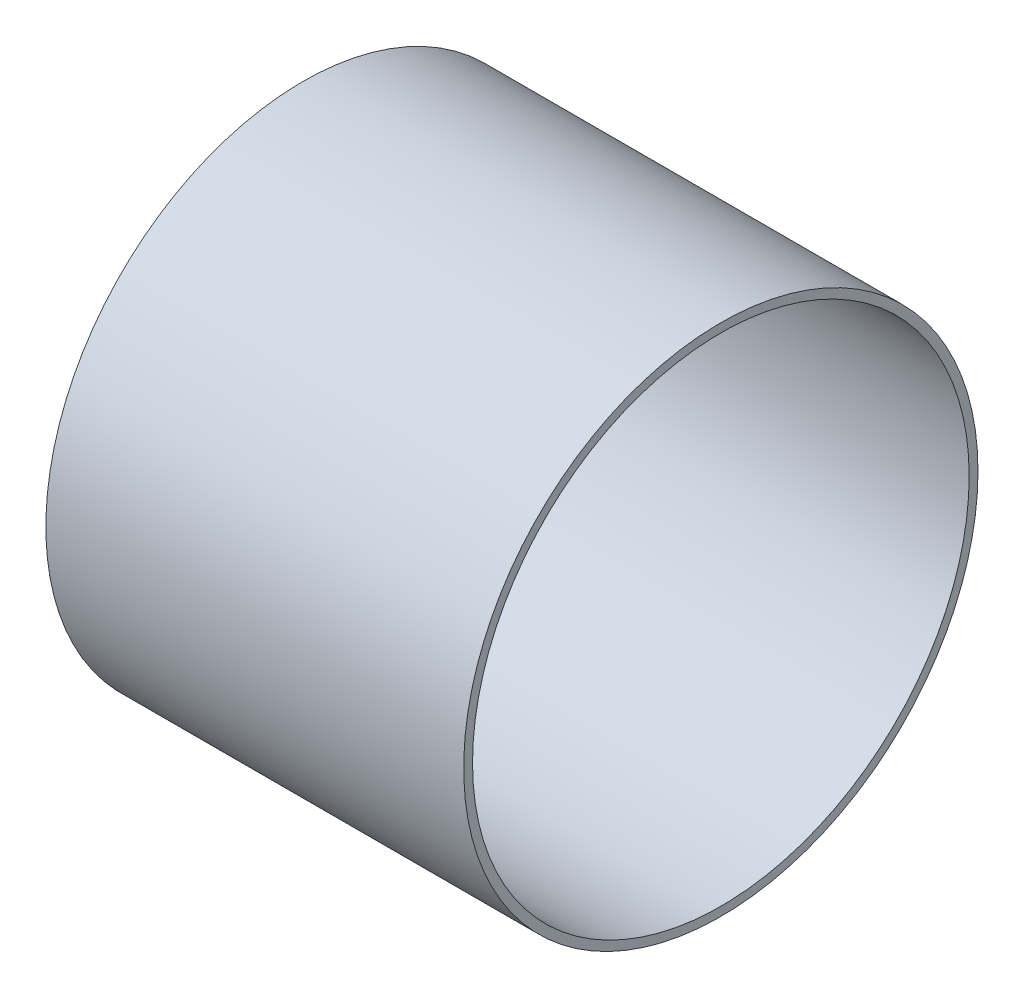
ISO-10303-21;
HEADER;
FILE_DESCRIPTION(('STEP AP214'),'2;1');
FILE_NAME('part.step','',(''),(''),'','','');
FILE_SCHEMA(('AUTOMOTIVE_DESIGN { 1 0 10303 214 1 1 1 1 }'));
ENDSEC;
DATA;
#1=APPLICATION_CONTEXT('core data for automotive mechanical design processes');
#2=APPLICATION_PROTOCOL_DEFINITION('international standard','automotive_design',2000,#1);
#3=PRODUCT_CONTEXT('',#1,'mechanical');
#4=PRODUCT('Part','Part','',(#3));
#5=PRODUCT_RELATED_PRODUCT_CATEGORY('part','',(#4));
#6=PRODUCT_DEFINITION_FORMATION('','',#4);
#7=PRODUCT_DEFINITION_CONTEXT('part definition',#1,'design');
#8=PRODUCT_DEFINITION('design','',#6,#7);
#9=PRODUCT_DEFINITION_SHAPE('','',#8);
#10=(LENGTH_UNIT() NAMED_UNIT(*) SI_UNIT(.MILLI.,.METRE.));
#11=(NAMED_UNIT(*) PLANE_ANGLE_UNIT() SI_UNIT($,.RADIAN.));
#12=(NAMED_UNIT(*) SI_UNIT($,.STERADIAN.) SOLID_ANGLE_UNIT());
#13=UNCERTAINTY_MEASURE_WITH_UNIT(LENGTH_MEASURE(1.E-05),#10,'distance_accuracy_value','');
#14=(GEOMETRIC_REPRESENTATION_CONTEXT(3) GLOBAL_UNCERTAINTY_ASSIGNED_CONTEXT((#13)) GLOBAL_UNIT_ASSIGNED_CONTEXT((#10,
#11,#12)) REPRESENTATION_CONTEXT('',''));
#15=CARTESIAN_POINT('',(0.,0.,0.));
#16=DIRECTION('',(0.,0.,1.));
#17=DIRECTION('',(1.,0.,0.));
#18=AXIS2_PLACEMENT_3D('',#15,#16,#17);
#19=CARTESIAN_POINT('',(89.,0.,0.));
#20=DIRECTION('',(1.,0.,0.));
#21=DIRECTION('',(0.,0.,-1.));
#22=AXIS2_PLACEMENT_3D('',#19,#20,#21);
#23=PLANE('',#22);
#24=CARTESIAN_POINT('',(89.,0.,0.));
#25=DIRECTION('',(1.,0.,0.));
#26=DIRECTION('',(0.,0.,-1.));
#27=AXIS2_PLACEMENT_3D('',#24,#25,#26);
#28=CIRCLE('',#27,109.5375);
#29=CARTESIAN_POINT('',(89.,0.,-109.5375));
#30=VERTEX_POINT('',#29);
#31=EDGE_CURVE('E10',#30,#30,#28,.T.);
#32=ORIENTED_EDGE('',*,*,#31,.T.);
#33=EDGE_LOOP('',(#32));
#34=FACE_BOUND('',#33,.T.);
#35=CARTESIAN_POINT('',(89.,0.,0.));
#36=DIRECTION('',(1.,0.,0.));
#37=DIRECTION('',(0.,0.,-1.));
#38=AXIS2_PLACEMENT_3D('',#35,#36,#37);
#39=CIRCLE('',#38,105.7783);
#40=CARTESIAN_POINT('',(89.,0.,-105.7783));
#41=VERTEX_POINT('',#40);
#42=EDGE_CURVE('E50',#41,#41,#39,.T.);
#43=ORIENTED_EDGE('',*,*,#42,.F.);
#44=EDGE_LOOP('',(#43));
#45=FACE_BOUND('',#44,.T.);
#46=ADVANCED_FACE('F37',(#34,#45),#23,.T.);
#47=CARTESIAN_POINT('',(-89.,0.,0.));
#48=DIRECTION('',(1.,0.,0.));
#49=DIRECTION('',(0.,0.,-1.));
#50=AXIS2_PLACEMENT_3D('',#47,#48,#49);
#51=PLANE('',#50);
#52=CARTESIAN_POINT('',(-89.,0.,0.));
#53=DIRECTION('',(1.,0.,0.));
#54=DIRECTION('',(0.,0.,-1.));
#55=AXIS2_PLACEMENT_3D('',#52,#53,#54);
#56=CIRCLE('',#55,109.5375);
#57=CARTESIAN_POINT('',(-89.,0.,-109.5375));
#58=VERTEX_POINT('',#57);
#59=EDGE_CURVE('E41',#58,#58,#56,.T.);
#60=ORIENTED_EDGE('',*,*,#59,.F.);
#61=EDGE_LOOP('',(#60));
#62=FACE_BOUND('',#61,.T.);
#63=CARTESIAN_POINT('',(-89.,0.,0.));
#64=DIRECTION('',(1.,0.,0.));
#65=DIRECTION('',(0.,0.,-1.));
#66=AXIS2_PLACEMENT_3D('',#63,#64,#65);
#67=CIRCLE('',#66,105.7783);
#68=CARTESIAN_POINT('',(-89.,0.,-105.7783));
#69=VERTEX_POINT('',#68);
#70=EDGE_CURVE('E52',#69,#69,#67,.T.);
#71=ORIENTED_EDGE('',*,*,#70,.T.);
#72=EDGE_LOOP('',(#71));
#73=FACE_BOUND('',#72,.T.);
#74=ADVANCED_FACE('F64',(#62,#73),#51,.F.);
#75=CARTESIAN_POINT('',(89.,0.,0.));
#76=DIRECTION('',(-1.,0.,0.));
#77=DIRECTION('',(0.,0.,1.));
#78=AXIS2_PLACEMENT_3D('',#75,#76,#77);
#79=CYLINDRICAL_SURFACE('',#78,109.5375);
#80=ORIENTED_EDGE('',*,*,#31,.F.);
#81=EDGE_LOOP('',(#80));
#82=FACE_BOUND('',#81,.T.);
#83=ORIENTED_EDGE('',*,*,#59,.T.);
#84=EDGE_LOOP('',(#83));
#85=FACE_BOUND('',#84,.T.);
#86=ADVANCED_FACE('F39',(#82,#85),#79,.T.);
#87=CARTESIAN_POINT('',(89.,0.,0.));
#88=DIRECTION('',(-1.,0.,0.));
#89=DIRECTION('',(0.,0.,1.));
#90=AXIS2_PLACEMENT_3D('',#87,#88,#89);
#91=CYLINDRICAL_SURFACE('',#90,105.7783);
#92=ORIENTED_EDGE('',*,*,#42,.T.);
#93=EDGE_LOOP('',(#92));
#94=FACE_BOUND('',#93,.T.);
#95=ORIENTED_EDGE('',*,*,#70,.F.);
#96=EDGE_LOOP('',(#95));
#97=FACE_BOUND('',#96,.T.);
#98=ADVANCED_FACE('F60',(#94,#97),#91,.F.);
#99=CLOSED_SHELL('',(#46,#74,#86,#98));
#100=MANIFOLD_SOLID_BREP('B2',#99);
#101=ADVANCED_BREP_SHAPE_REPRESENTATION('',(#18,#100),#14);
#102=SHAPE_DEFINITION_REPRESENTATION(#9,#101);
ENDSEC;
END-ISO-10303-21;
